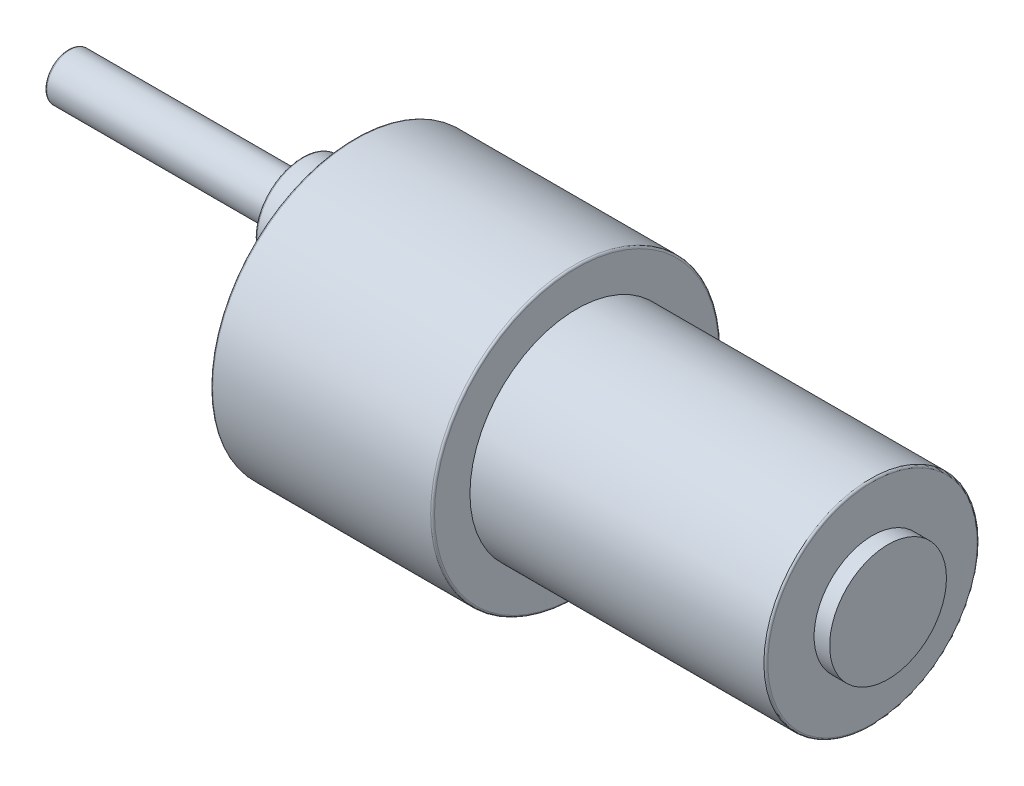
ISO-10303-21;
HEADER;
FILE_DESCRIPTION(('STEP AP214'),'2;1');
FILE_NAME('part.step','',(''),(''),'','','');
FILE_SCHEMA(('AUTOMOTIVE_DESIGN { 1 0 10303 214 1 1 1 1 }'));
ENDSEC;
DATA;
#1=APPLICATION_CONTEXT('core data for automotive mechanical design processes');
#2=APPLICATION_PROTOCOL_DEFINITION('international standard','automotive_design',2000,#1);
#3=PRODUCT_CONTEXT('',#1,'mechanical');
#4=PRODUCT('Part','Part','',(#3));
#5=PRODUCT_RELATED_PRODUCT_CATEGORY('part','',(#4));
#6=PRODUCT_DEFINITION_FORMATION('','',#4);
#7=PRODUCT_DEFINITION_CONTEXT('part definition',#1,'design');
#8=PRODUCT_DEFINITION('design','',#6,#7);
#9=PRODUCT_DEFINITION_SHAPE('','',#8);
#10=(LENGTH_UNIT() NAMED_UNIT(*) SI_UNIT(.MILLI.,.METRE.));
#11=(NAMED_UNIT(*) PLANE_ANGLE_UNIT() SI_UNIT($,.RADIAN.));
#12=(NAMED_UNIT(*) SI_UNIT($,.STERADIAN.) SOLID_ANGLE_UNIT());
#13=UNCERTAINTY_MEASURE_WITH_UNIT(LENGTH_MEASURE(1.E-05),#10,'distance_accuracy_value','');
#14=(GEOMETRIC_REPRESENTATION_CONTEXT(3) GLOBAL_UNCERTAINTY_ASSIGNED_CONTEXT((#13)) GLOBAL_UNIT_ASSIGNED_CONTEXT((#10,
#11,#12)) REPRESENTATION_CONTEXT('',''));
#15=CARTESIAN_POINT('',(0.,0.,0.));
#16=DIRECTION('',(0.,0.,1.));
#17=DIRECTION('',(1.,0.,0.));
#18=AXIS2_PLACEMENT_3D('',#15,#16,#17);
#19=CARTESIAN_POINT('',(28.5,0.,0.));
#20=DIRECTION('',(-1.,0.,0.));
#21=DIRECTION('',(0.,0.,1.));
#22=AXIS2_PLACEMENT_3D('',#19,#20,#21);
#23=CYLINDRICAL_SURFACE('',#22,18.5);
#24=CARTESIAN_POINT('',(28.25,0.,0.));
#25=DIRECTION('',(1.,0.,0.));
#26=DIRECTION('',(0.,0.,-1.));
#27=AXIS2_PLACEMENT_3D('',#24,#25,#26);
#28=CIRCLE('',#27,18.5);
#29=CARTESIAN_POINT('',(28.25,0.,18.5));
#30=VERTEX_POINT('',#29);
#31=EDGE_CURVE('E130',#30,#30,#28,.F.);
#32=CARTESIAN_POINT('',(0.25,0.,0.));
#33=DIRECTION('',(1.,0.,0.));
#34=DIRECTION('',(0.,0.,-1.));
#35=AXIS2_PLACEMENT_3D('',#32,#33,#34);
#36=CIRCLE('',#35,18.5);
#37=CARTESIAN_POINT('',(0.25,0.,18.5));
#38=VERTEX_POINT('',#37);
#39=EDGE_CURVE('E127',#38,#38,#36,.T.);
#40=CARTESIAN_POINT('',(28.25,0.,18.5));
#41=CARTESIAN_POINT('',(27.9583333333333,0.,18.5));
#42=CARTESIAN_POINT('',(27.6666666666667,0.,18.5));
#43=CARTESIAN_POINT('',(27.0833333333333,0.,18.5));
#44=CARTESIAN_POINT('',(26.7916666666667,0.,18.5));
#45=CARTESIAN_POINT('',(26.2083333333333,0.,18.5));
#46=CARTESIAN_POINT('',(25.9166666666667,0.,18.5));
#47=CARTESIAN_POINT('',(25.3333333333333,0.,18.5));
#48=CARTESIAN_POINT('',(25.0416666666667,0.,18.5));
#49=CARTESIAN_POINT('',(24.4583333333333,0.,18.5));
#50=CARTESIAN_POINT('',(24.1666666666667,0.,18.5));
#51=CARTESIAN_POINT('',(23.5833333333333,0.,18.5));
#52=CARTESIAN_POINT('',(23.2916666666667,0.,18.5));
#53=CARTESIAN_POINT('',(22.7083333333333,0.,18.5));
#54=CARTESIAN_POINT('',(22.4166666666667,0.,18.5));
#55=CARTESIAN_POINT('',(21.8333333333333,0.,18.5));
#56=CARTESIAN_POINT('',(21.5416666666667,0.,18.5));
#57=CARTESIAN_POINT('',(20.9583333333333,0.,18.5));
#58=CARTESIAN_POINT('',(20.6666666666667,0.,18.5));
#59=CARTESIAN_POINT('',(20.0833333333333,0.,18.5));
#60=CARTESIAN_POINT('',(19.7916666666667,0.,18.5));
#61=CARTESIAN_POINT('',(19.2083333333333,0.,18.5));
#62=CARTESIAN_POINT('',(18.9166666666667,0.,18.5));
#63=CARTESIAN_POINT('',(18.3333333333333,0.,18.5));
#64=CARTESIAN_POINT('',(18.0416666666667,0.,18.5));
#65=CARTESIAN_POINT('',(17.4583333333333,0.,18.5));
#66=CARTESIAN_POINT('',(17.1666666666667,0.,18.5));
#67=CARTESIAN_POINT('',(16.5833333333333,0.,18.5));
#68=CARTESIAN_POINT('',(16.2916666666667,0.,18.5));
#69=CARTESIAN_POINT('',(15.7083333333333,0.,18.5));
#70=CARTESIAN_POINT('',(15.4166666666667,0.,18.5));
#71=CARTESIAN_POINT('',(14.8333333333333,0.,18.5));
#72=CARTESIAN_POINT('',(14.5416666666667,0.,18.5));
#73=CARTESIAN_POINT('',(13.9583333333333,0.,18.5));
#74=CARTESIAN_POINT('',(13.6666666666667,0.,18.5));
#75=CARTESIAN_POINT('',(13.0833333333333,0.,18.5));
#76=CARTESIAN_POINT('',(12.7916666666667,0.,18.5));
#77=CARTESIAN_POINT('',(12.2083333333333,0.,18.5));
#78=CARTESIAN_POINT('',(11.9166666666667,0.,18.5));
#79=CARTESIAN_POINT('',(11.3333333333333,0.,18.5));
#80=CARTESIAN_POINT('',(11.0416666666667,0.,18.5));
#81=CARTESIAN_POINT('',(10.4583333333333,0.,18.5));
#82=CARTESIAN_POINT('',(10.1666666666667,0.,18.5));
#83=CARTESIAN_POINT('',(9.58333333333333,0.,18.5));
#84=CARTESIAN_POINT('',(9.29166666666667,0.,18.5));
#85=CARTESIAN_POINT('',(8.70833333333333,0.,18.5));
#86=CARTESIAN_POINT('',(8.41666666666667,0.,18.5));
#87=CARTESIAN_POINT('',(7.83333333333333,0.,18.5));
#88=CARTESIAN_POINT('',(7.54166666666667,0.,18.5));
#89=CARTESIAN_POINT('',(6.95833333333333,0.,18.5));
#90=CARTESIAN_POINT('',(6.66666666666667,0.,18.5));
#91=CARTESIAN_POINT('',(6.08333333333333,0.,18.5));
#92=CARTESIAN_POINT('',(5.79166666666666,0.,18.5));
#93=CARTESIAN_POINT('',(5.20833333333333,0.,18.5));
#94=CARTESIAN_POINT('',(4.91666666666666,0.,18.5));
#95=CARTESIAN_POINT('',(4.33333333333333,0.,18.5));
#96=CARTESIAN_POINT('',(4.04166666666666,0.,18.5));
#97=CARTESIAN_POINT('',(3.45833333333333,0.,18.5));
#98=CARTESIAN_POINT('',(3.16666666666666,0.,18.5));
#99=CARTESIAN_POINT('',(2.58333333333333,0.,18.5));
#100=CARTESIAN_POINT('',(2.29166666666667,0.,18.5));
#101=CARTESIAN_POINT('',(1.70833333333333,0.,18.5));
#102=CARTESIAN_POINT('',(1.41666666666667,0.,18.5));
#103=CARTESIAN_POINT('',(0.833333333333334,0.,18.5));
#104=CARTESIAN_POINT('',(0.541666666666667,0.,18.5));
#105=CARTESIAN_POINT('',(0.25,0.,18.5));
#106=B_SPLINE_CURVE_WITH_KNOTS('',3,(#40,#41,#42,#43,#44,#45,#46,#47,#48,#49,#50,#51,#52,#53,
#54,#55,#56,#57,#58,#59,#60,#61,#62,#63,#64,#65,#66,#67,#68,#69,#70,#71,#72,#73,#74,#75,#76,#77,
#78,#79,#80,#81,#82,#83,#84,#85,#86,#87,#88,#89,#90,#91,#92,#93,#94,#95,#96,#97,#98,#99,#100,
#101,#102,#103,#104,#105),.UNSPECIFIED.,.F.,.F.,(4,2,2,2,2,2,2,2,2,2,2,2,2,2,2,2,2,2,2,2,2,2,2,
2,2,2,2,2,2,2,2,2,4),(0.,0.875000000000001,1.75,2.625,3.5,4.375,5.25,6.125,7.,7.875,8.75,9.625,
10.5,11.375,12.25,13.125,14.,14.875,15.75,16.625,17.5,18.375,19.25,20.125,21.,21.875,22.75,
23.625,24.5,25.375,26.25,27.125,28.),.UNSPECIFIED.);
#107=EDGE_CURVE('BSEAM37',#30,#38,#106,.T.);
#108=ORIENTED_EDGE('',*,*,#31,.T.);
#109=ORIENTED_EDGE('',*,*,#39,.T.);
#110=ORIENTED_EDGE('',*,*,#107,.T.);
#111=ORIENTED_EDGE('',*,*,#107,.F.);
#112=EDGE_LOOP('',(#108,#110,#109,#111));
#113=FACE_BOUND('',#112,.T.);
#114=ADVANCED_FACE('F37',(#113),#23,.T.);
#115=CARTESIAN_POINT('',(28.5,0.,0.));
#116=DIRECTION('',(1.,0.,0.));
#117=DIRECTION('',(0.,0.,-1.));
#118=AXIS2_PLACEMENT_3D('',#115,#116,#117);
#119=PLANE('',#118);
#120=CARTESIAN_POINT('',(28.5,0.,0.));
#121=DIRECTION('',(1.,0.,0.));
#122=DIRECTION('',(0.,0.,-1.));
#123=AXIS2_PLACEMENT_3D('',#120,#121,#122);
#124=CIRCLE('',#123,18.25);
#125=CARTESIAN_POINT('',(28.5,0.,-18.25));
#126=VERTEX_POINT('',#125);
#127=EDGE_CURVE('E124',#126,#126,#124,.T.);
#128=ORIENTED_EDGE('',*,*,#127,.T.);
#129=EDGE_LOOP('',(#128));
#130=FACE_BOUND('',#129,.T.);
#131=CARTESIAN_POINT('',(28.5,0.,0.));
#132=DIRECTION('',(1.,0.,0.));
#133=DIRECTION('',(0.,0.,-1.));
#134=AXIS2_PLACEMENT_3D('',#131,#132,#133);
#135=CIRCLE('',#134,13.7);
#136=CARTESIAN_POINT('',(28.5,0.,-13.7));
#137=VERTEX_POINT('',#136);
#138=EDGE_CURVE('E113',#137,#137,#135,.T.);
#139=ORIENTED_EDGE('',*,*,#138,.F.);
#140=EDGE_LOOP('',(#139));
#141=FACE_BOUND('',#140,.T.);
#142=ADVANCED_FACE('F173',(#130,#141),#119,.T.);
#143=CARTESIAN_POINT('',(0.,0.,0.));
#144=DIRECTION('',(1.,0.,0.));
#145=DIRECTION('',(0.,0.,-1.));
#146=AXIS2_PLACEMENT_3D('',#143,#144,#145);
#147=PLANE('',#146);
#148=CARTESIAN_POINT('',(0.,0.,0.));
#149=DIRECTION('',(1.,0.,0.));
#150=DIRECTION('',(0.,0.,-1.));
#151=AXIS2_PLACEMENT_3D('',#148,#149,#150);
#152=CIRCLE('',#151,18.25);
#153=CARTESIAN_POINT('',(0.,0.,-18.25));
#154=VERTEX_POINT('',#153);
#155=EDGE_CURVE('E136',#154,#154,#152,.F.);
#156=ORIENTED_EDGE('',*,*,#155,.T.);
#157=EDGE_LOOP('',(#156));
#158=FACE_BOUND('',#157,.T.);
#159=CARTESIAN_POINT('',(0.,7.,0.));
#160=DIRECTION('',(1.,0.,0.));
#161=DIRECTION('',(0.,0.,-1.));
#162=AXIS2_PLACEMENT_3D('',#159,#160,#161);
#163=CIRCLE('',#162,6.25);
#164=CARTESIAN_POINT('',(0.,7.,-6.25));
#165=VERTEX_POINT('',#164);
#166=EDGE_CURVE('E133',#165,#165,#163,.T.);
#167=ORIENTED_EDGE('',*,*,#166,.T.);
#168=EDGE_LOOP('',(#167));
#169=FACE_BOUND('',#168,.T.);
#170=CARTESIAN_POINT('',(0.,15.75,0.));
#171=DIRECTION('',(-1.,0.,0.));
#172=DIRECTION('',(0.,0.,1.));
#173=AXIS2_PLACEMENT_3D('',#170,#171,#172);
#174=CIRCLE('',#173,1.25);
#175=CARTESIAN_POINT('',(0.,15.75,1.25));
#176=VERTEX_POINT('',#175);
#177=EDGE_CURVE('E75',#176,#176,#174,.T.);
#178=ORIENTED_EDGE('',*,*,#177,.F.);
#179=EDGE_LOOP('',(#178));
#180=FACE_BOUND('',#179,.T.);
#181=CARTESIAN_POINT('',(0.,7.87499999999997,13.6399001096049));
#182=DIRECTION('',(-1.,0.,0.));
#183=DIRECTION('',(0.,0.,1.));
#184=AXIS2_PLACEMENT_3D('',#181,#182,#183);
#185=CIRCLE('',#184,1.25);
#186=CARTESIAN_POINT('',(0.,7.87499999999997,14.8899001096049));
#187=VERTEX_POINT('',#186);
#188=EDGE_CURVE('E74',#187,#187,#185,.T.);
#189=ORIENTED_EDGE('',*,*,#188,.F.);
#190=EDGE_LOOP('',(#189));
#191=FACE_BOUND('',#190,.T.);
#192=CARTESIAN_POINT('',(0.,-7.87500000000006,13.6399001096049));
#193=DIRECTION('',(-1.,0.,0.));
#194=DIRECTION('',(0.,0.,1.));
#195=AXIS2_PLACEMENT_3D('',#192,#193,#194);
#196=CIRCLE('',#195,1.25);
#197=CARTESIAN_POINT('',(0.,-7.87500000000006,14.8899001096049));
#198=VERTEX_POINT('',#197);
#199=EDGE_CURVE('E85',#198,#198,#196,.T.);
#200=ORIENTED_EDGE('',*,*,#199,.F.);
#201=EDGE_LOOP('',(#200));
#202=FACE_BOUND('',#201,.T.);
#203=CARTESIAN_POINT('',(0.,-15.75,-1.09981662173559E-13));
#204=DIRECTION('',(-1.,0.,0.));
#205=DIRECTION('',(0.,0.,1.));
#206=AXIS2_PLACEMENT_3D('',#203,#204,#205);
#207=CIRCLE('',#206,1.25);
#208=CARTESIAN_POINT('',(0.,-15.75,1.24999999999989));
#209=VERTEX_POINT('',#208);
#210=EDGE_CURVE('E91',#209,#209,#207,.T.);
#211=ORIENTED_EDGE('',*,*,#210,.F.);
#212=EDGE_LOOP('',(#211));
#213=FACE_BOUND('',#212,.T.);
#214=CARTESIAN_POINT('',(0.,-7.87499999999987,-13.639900109605));
#215=DIRECTION('',(-1.,0.,0.));
#216=DIRECTION('',(0.,0.,1.));
#217=AXIS2_PLACEMENT_3D('',#214,#215,#216);
#218=CIRCLE('',#217,1.25);
#219=CARTESIAN_POINT('',(0.,-7.87499999999987,-12.389900109605));
#220=VERTEX_POINT('',#219);
#221=EDGE_CURVE('E97',#220,#220,#218,.T.);
#222=ORIENTED_EDGE('',*,*,#221,.F.);
#223=EDGE_LOOP('',(#222));
#224=FACE_BOUND('',#223,.T.);
#225=CARTESIAN_POINT('',(0.,7.87500000000016,-13.6399001096048));
#226=DIRECTION('',(-1.,0.,0.));
#227=DIRECTION('',(0.,0.,1.));
#228=AXIS2_PLACEMENT_3D('',#225,#226,#227);
#229=CIRCLE('',#228,1.25);
#230=CARTESIAN_POINT('',(0.,7.87500000000016,-12.3899001096048));
#231=VERTEX_POINT('',#230);
#232=EDGE_CURVE('E103',#231,#231,#229,.T.);
#233=ORIENTED_EDGE('',*,*,#232,.F.);
#234=EDGE_LOOP('',(#233));
#235=FACE_BOUND('',#234,.T.);
#236=ADVANCED_FACE('F179',(#158,#169,#180,#191,#202,#213,#224,#235),#147,.F.);
#237=CARTESIAN_POINT('',(66.5,0.,0.));
#238=DIRECTION('',(-1.,0.,0.));
#239=DIRECTION('',(0.,0.,1.));
#240=AXIS2_PLACEMENT_3D('',#237,#238,#239);
#241=CYLINDRICAL_SURFACE('',#240,13.7);
#242=CARTESIAN_POINT('',(66.25,0.,0.));
#243=DIRECTION('',(1.,0.,0.));
#244=DIRECTION('',(0.,0.,-1.));
#245=AXIS2_PLACEMENT_3D('',#242,#243,#244);
#246=CIRCLE('',#245,13.7);
#247=CARTESIAN_POINT('',(66.25,0.,-13.7));
#248=VERTEX_POINT('',#247);
#249=EDGE_CURVE('E121',#248,#248,#246,.F.);
#250=ORIENTED_EDGE('',*,*,#249,.T.);
#251=EDGE_LOOP('',(#250));
#252=FACE_BOUND('',#251,.T.);
#253=ORIENTED_EDGE('',*,*,#138,.T.);
#254=EDGE_LOOP('',(#253));
#255=FACE_BOUND('',#254,.T.);
#256=ADVANCED_FACE('F274',(#252,#255),#241,.T.);
#257=CARTESIAN_POINT('',(66.5,0.,0.));
#258=DIRECTION('',(1.,0.,0.));
#259=DIRECTION('',(0.,0.,-1.));
#260=AXIS2_PLACEMENT_3D('',#257,#258,#259);
#261=PLANE('',#260);
#262=CARTESIAN_POINT('',(66.5,0.,0.));
#263=DIRECTION('',(1.,0.,0.));
#264=DIRECTION('',(0.,0.,-1.));
#265=AXIS2_PLACEMENT_3D('',#262,#263,#264);
#266=CIRCLE('',#265,13.45);
#267=CARTESIAN_POINT('',(66.5,0.,-13.45));
#268=VERTEX_POINT('',#267);
#269=EDGE_CURVE('E118',#268,#268,#266,.T.);
#270=ORIENTED_EDGE('',*,*,#269,.T.);
#271=EDGE_LOOP('',(#270));
#272=FACE_BOUND('',#271,.T.);
#273=CARTESIAN_POINT('',(66.5,0.,0.));
#274=DIRECTION('',(1.,0.,0.));
#275=DIRECTION('',(0.,0.,-1.));
#276=AXIS2_PLACEMENT_3D('',#273,#274,#275);
#277=CIRCLE('',#276,7.5);
#278=CARTESIAN_POINT('',(66.5,0.,-7.5));
#279=VERTEX_POINT('',#278);
#280=EDGE_CURVE('E109',#279,#279,#277,.T.);
#281=ORIENTED_EDGE('',*,*,#280,.F.);
#282=EDGE_LOOP('',(#281));
#283=FACE_BOUND('',#282,.T.);
#284=ADVANCED_FACE('F270',(#272,#283),#261,.T.);
#285=CARTESIAN_POINT('',(68.5,0.,0.));
#286=DIRECTION('',(-1.,0.,0.));
#287=DIRECTION('',(0.,0.,1.));
#288=AXIS2_PLACEMENT_3D('',#285,#286,#287);
#289=CYLINDRICAL_SURFACE('',#288,7.5);
#290=CARTESIAN_POINT('',(68.5,0.,0.));
#291=DIRECTION('',(1.,0.,0.));
#292=DIRECTION('',(0.,0.,-1.));
#293=AXIS2_PLACEMENT_3D('',#290,#291,#292);
#294=CIRCLE('',#293,7.5);
#295=CARTESIAN_POINT('',(68.5,0.,-7.5));
#296=VERTEX_POINT('',#295);
#297=EDGE_CURVE('E110',#296,#296,#294,.T.);
#298=ORIENTED_EDGE('',*,*,#297,.F.);
#299=EDGE_LOOP('',(#298));
#300=FACE_BOUND('',#299,.T.);
#301=ORIENTED_EDGE('',*,*,#280,.T.);
#302=EDGE_LOOP('',(#301));
#303=FACE_BOUND('',#302,.T.);
#304=ADVANCED_FACE('F266',(#300,#303),#289,.T.);
#305=CARTESIAN_POINT('',(68.5,0.,0.));
#306=DIRECTION('',(1.,0.,0.));
#307=DIRECTION('',(0.,0.,-1.));
#308=AXIS2_PLACEMENT_3D('',#305,#306,#307);
#309=PLANE('',#308);
#310=ORIENTED_EDGE('',*,*,#297,.T.);
#311=EDGE_LOOP('',(#310));
#312=FACE_BOUND('',#311,.T.);
#313=ADVANCED_FACE('F263',(#312),#309,.T.);
#314=CARTESIAN_POINT('',(5.,7.87500000000016,-13.6399001096048));
#315=DIRECTION('',(-1.,0.,0.));
#316=DIRECTION('',(0.,0.,1.));
#317=AXIS2_PLACEMENT_3D('',#314,#315,#316);
#318=CONICAL_SURFACE('',#317,1.25,1.02974425867665);
#319=CARTESIAN_POINT('',(5.75107577378445,7.87500000000016,-13.6399001096048));
#320=VERTEX_POINT('',#319);
#321=VERTEX_LOOP('',#320);
#322=FACE_BOUND('',#321,.T.);
#323=CARTESIAN_POINT('',(5.,7.87500000000016,-13.6399001096048));
#324=DIRECTION('',(-1.,0.,0.));
#325=DIRECTION('',(0.,0.,1.));
#326=AXIS2_PLACEMENT_3D('',#323,#324,#325);
#327=CIRCLE('',#326,1.25);
#328=CARTESIAN_POINT('',(5.,7.87500000000016,-12.3899001096048));
#329=VERTEX_POINT('',#328);
#330=EDGE_CURVE('E106',#329,#329,#327,.T.);
#331=ORIENTED_EDGE('',*,*,#330,.T.);
#332=EDGE_LOOP('',(#331));
#333=FACE_BOUND('',#332,.T.);
#334=ADVANCED_FACE('F259',(#322,#333),#318,.F.);
#335=CARTESIAN_POINT('',(0.,7.87500000000016,-13.6399001096048));
#336=DIRECTION('',(-1.,0.,0.));
#337=DIRECTION('',(0.,0.,1.));
#338=AXIS2_PLACEMENT_3D('',#335,#336,#337);
#339=CYLINDRICAL_SURFACE('',#338,1.25);
#340=ORIENTED_EDGE('',*,*,#330,.F.);
#341=EDGE_LOOP('',(#340));
#342=FACE_BOUND('',#341,.T.);
#343=ORIENTED_EDGE('',*,*,#232,.T.);
#344=EDGE_LOOP('',(#343));
#345=FACE_BOUND('',#344,.T.);
#346=ADVANCED_FACE('F256',(#342,#345),#339,.F.);
#347=CARTESIAN_POINT('',(5.,-7.87499999999987,-13.639900109605));
#348=DIRECTION('',(-1.,0.,0.));
#349=DIRECTION('',(0.,0.,1.));
#350=AXIS2_PLACEMENT_3D('',#347,#348,#349);
#351=CONICAL_SURFACE('',#350,1.25,1.02974425867665);
#352=CARTESIAN_POINT('',(5.75107577378445,-7.87499999999987,-13.639900109605));
#353=VERTEX_POINT('',#352);
#354=VERTEX_LOOP('',#353);
#355=FACE_BOUND('',#354,.T.);
#356=CARTESIAN_POINT('',(5.,-7.87499999999987,-13.639900109605));
#357=DIRECTION('',(-1.,0.,0.));
#358=DIRECTION('',(0.,0.,1.));
#359=AXIS2_PLACEMENT_3D('',#356,#357,#358);
#360=CIRCLE('',#359,1.25);
#361=CARTESIAN_POINT('',(5.,-7.87499999999987,-12.389900109605));
#362=VERTEX_POINT('',#361);
#363=EDGE_CURVE('E100',#362,#362,#360,.T.);
#364=ORIENTED_EDGE('',*,*,#363,.T.);
#365=EDGE_LOOP('',(#364));
#366=FACE_BOUND('',#365,.T.);
#367=ADVANCED_FACE('F252',(#355,#366),#351,.F.);
#368=CARTESIAN_POINT('',(0.,-7.87499999999987,-13.639900109605));
#369=DIRECTION('',(-1.,0.,0.));
#370=DIRECTION('',(0.,0.,1.));
#371=AXIS2_PLACEMENT_3D('',#368,#369,#370);
#372=CYLINDRICAL_SURFACE('',#371,1.25);
#373=ORIENTED_EDGE('',*,*,#363,.F.);
#374=EDGE_LOOP('',(#373));
#375=FACE_BOUND('',#374,.T.);
#376=ORIENTED_EDGE('',*,*,#221,.T.);
#377=EDGE_LOOP('',(#376));
#378=FACE_BOUND('',#377,.T.);
#379=ADVANCED_FACE('F248',(#375,#378),#372,.F.);
#380=CARTESIAN_POINT('',(5.,-15.75,-1.09981662173559E-13));
#381=DIRECTION('',(-1.,0.,0.));
#382=DIRECTION('',(0.,0.,1.));
#383=AXIS2_PLACEMENT_3D('',#380,#381,#382);
#384=CONICAL_SURFACE('',#383,1.25,1.02974425867665);
#385=CARTESIAN_POINT('',(5.75107577378445,-15.75,-1.09981662173559E-13));
#386=VERTEX_POINT('',#385);
#387=VERTEX_LOOP('',#386);
#388=FACE_BOUND('',#387,.T.);
#389=CARTESIAN_POINT('',(5.,-15.75,-1.09981662173559E-13));
#390=DIRECTION('',(-1.,0.,0.));
#391=DIRECTION('',(0.,0.,1.));
#392=AXIS2_PLACEMENT_3D('',#389,#390,#391);
#393=CIRCLE('',#392,1.25);
#394=CARTESIAN_POINT('',(5.,-15.75,1.24999999999989));
#395=VERTEX_POINT('',#394);
#396=EDGE_CURVE('E94',#395,#395,#393,.T.);
#397=ORIENTED_EDGE('',*,*,#396,.T.);
#398=EDGE_LOOP('',(#397));
#399=FACE_BOUND('',#398,.T.);
#400=ADVANCED_FACE('F244',(#388,#399),#384,.F.);
#401=CARTESIAN_POINT('',(0.,-15.75,-1.09981662173559E-13));
#402=DIRECTION('',(-1.,0.,0.));
#403=DIRECTION('',(0.,0.,1.));
#404=AXIS2_PLACEMENT_3D('',#401,#402,#403);
#405=CYLINDRICAL_SURFACE('',#404,1.25);
#406=ORIENTED_EDGE('',*,*,#396,.F.);
#407=EDGE_LOOP('',(#406));
#408=FACE_BOUND('',#407,.T.);
#409=ORIENTED_EDGE('',*,*,#210,.T.);
#410=EDGE_LOOP('',(#409));
#411=FACE_BOUND('',#410,.T.);
#412=ADVANCED_FACE('F240',(#408,#411),#405,.F.);
#413=CARTESIAN_POINT('',(5.,-7.87500000000006,13.6399001096049));
#414=DIRECTION('',(-1.,0.,0.));
#415=DIRECTION('',(0.,0.,1.));
#416=AXIS2_PLACEMENT_3D('',#413,#414,#415);
#417=CONICAL_SURFACE('',#416,1.25,1.02974425867665);
#418=CARTESIAN_POINT('',(5.75107577378445,-7.87500000000007,13.6399001096049));
#419=VERTEX_POINT('',#418);
#420=VERTEX_LOOP('',#419);
#421=FACE_BOUND('',#420,.T.);
#422=CARTESIAN_POINT('',(5.,-7.87500000000006,13.6399001096049));
#423=DIRECTION('',(-1.,0.,0.));
#424=DIRECTION('',(0.,0.,1.));
#425=AXIS2_PLACEMENT_3D('',#422,#423,#424);
#426=CIRCLE('',#425,1.25);
#427=CARTESIAN_POINT('',(5.,-7.87500000000006,14.8899001096049));
#428=VERTEX_POINT('',#427);
#429=EDGE_CURVE('E88',#428,#428,#426,.T.);
#430=ORIENTED_EDGE('',*,*,#429,.T.);
#431=EDGE_LOOP('',(#430));
#432=FACE_BOUND('',#431,.T.);
#433=ADVANCED_FACE('F236',(#421,#432),#417,.F.);
#434=CARTESIAN_POINT('',(0.,-7.87500000000006,13.6399001096049));
#435=DIRECTION('',(-1.,0.,0.));
#436=DIRECTION('',(0.,0.,1.));
#437=AXIS2_PLACEMENT_3D('',#434,#435,#436);
#438=CYLINDRICAL_SURFACE('',#437,1.25);
#439=ORIENTED_EDGE('',*,*,#429,.F.);
#440=EDGE_LOOP('',(#439));
#441=FACE_BOUND('',#440,.T.);
#442=ORIENTED_EDGE('',*,*,#199,.T.);
#443=EDGE_LOOP('',(#442));
#444=FACE_BOUND('',#443,.T.);
#445=ADVANCED_FACE('F232',(#441,#444),#438,.F.);
#446=CARTESIAN_POINT('',(5.,7.87499999999997,13.6399001096049));
#447=DIRECTION('',(-1.,0.,0.));
#448=DIRECTION('',(0.,0.,1.));
#449=AXIS2_PLACEMENT_3D('',#446,#447,#448);
#450=CONICAL_SURFACE('',#449,1.25,1.02974425867665);
#451=CARTESIAN_POINT('',(5.75107577378445,7.87499999999997,13.6399001096049));
#452=VERTEX_POINT('',#451);
#453=VERTEX_LOOP('',#452);
#454=FACE_BOUND('',#453,.T.);
#455=CARTESIAN_POINT('',(5.,7.87499999999997,13.6399001096049));
#456=DIRECTION('',(-1.,0.,0.));
#457=DIRECTION('',(0.,0.,1.));
#458=AXIS2_PLACEMENT_3D('',#455,#456,#457);
#459=CIRCLE('',#458,1.25);
#460=CARTESIAN_POINT('',(5.,7.87499999999997,14.8899001096049));
#461=VERTEX_POINT('',#460);
#462=EDGE_CURVE('E78',#461,#461,#459,.T.);
#463=ORIENTED_EDGE('',*,*,#462,.T.);
#464=EDGE_LOOP('',(#463));
#465=FACE_BOUND('',#464,.T.);
#466=ADVANCED_FACE('F228',(#454,#465),#450,.F.);
#467=CARTESIAN_POINT('',(0.,7.87499999999997,13.6399001096049));
#468=DIRECTION('',(-1.,0.,0.));
#469=DIRECTION('',(0.,0.,1.));
#470=AXIS2_PLACEMENT_3D('',#467,#468,#469);
#471=CYLINDRICAL_SURFACE('',#470,1.25);
#472=ORIENTED_EDGE('',*,*,#462,.F.);
#473=EDGE_LOOP('',(#472));
#474=FACE_BOUND('',#473,.T.);
#475=ORIENTED_EDGE('',*,*,#188,.T.);
#476=EDGE_LOOP('',(#475));
#477=FACE_BOUND('',#476,.T.);
#478=ADVANCED_FACE('F68',(#474,#477),#471,.F.);
#479=CARTESIAN_POINT('',(5.,15.75,0.));
#480=DIRECTION('',(-1.,0.,0.));
#481=DIRECTION('',(0.,0.,1.));
#482=AXIS2_PLACEMENT_3D('',#479,#480,#481);
#483=CONICAL_SURFACE('',#482,1.25,1.02974425867665);
#484=CARTESIAN_POINT('',(5.75107577378445,15.75,0.));
#485=VERTEX_POINT('',#484);
#486=VERTEX_LOOP('',#485);
#487=FACE_BOUND('',#486,.T.);
#488=CARTESIAN_POINT('',(5.,15.75,0.));
#489=DIRECTION('',(-1.,0.,0.));
#490=DIRECTION('',(0.,0.,1.));
#491=AXIS2_PLACEMENT_3D('',#488,#489,#490);
#492=CIRCLE('',#491,1.25);
#493=CARTESIAN_POINT('',(5.,15.75,1.25));
#494=VERTEX_POINT('',#493);
#495=EDGE_CURVE('E72',#494,#494,#492,.T.);
#496=ORIENTED_EDGE('',*,*,#495,.T.);
#497=EDGE_LOOP('',(#496));
#498=FACE_BOUND('',#497,.T.);
#499=ADVANCED_FACE('F64',(#487,#498),#483,.F.);
#500=CARTESIAN_POINT('',(0.,15.75,0.));
#501=DIRECTION('',(-1.,0.,0.));
#502=DIRECTION('',(0.,0.,1.));
#503=AXIS2_PLACEMENT_3D('',#500,#501,#502);
#504=CYLINDRICAL_SURFACE('',#503,1.25);
#505=ORIENTED_EDGE('',*,*,#495,.F.);
#506=EDGE_LOOP('',(#505));
#507=FACE_BOUND('',#506,.T.);
#508=ORIENTED_EDGE('',*,*,#177,.T.);
#509=EDGE_LOOP('',(#508));
#510=FACE_BOUND('',#509,.T.);
#511=ADVANCED_FACE('F67',(#507,#510),#504,.F.);
#512=CARTESIAN_POINT('',(-6.8,7.,0.));
#513=DIRECTION('',(1.,0.,0.));
#514=DIRECTION('',(0.,0.,-1.));
#515=AXIS2_PLACEMENT_3D('',#512,#513,#514);
#516=CYLINDRICAL_SURFACE('',#515,6.);
#517=CARTESIAN_POINT('',(-0.25,7.,0.));
#518=DIRECTION('',(1.,0.,0.));
#519=DIRECTION('',(0.,0.,-1.));
#520=AXIS2_PLACEMENT_3D('',#517,#518,#519);
#521=CIRCLE('',#520,6.);
#522=CARTESIAN_POINT('',(-0.25,7.,-6.));
#523=VERTEX_POINT('',#522);
#524=EDGE_CURVE('E142',#523,#523,#521,.F.);
#525=ORIENTED_EDGE('',*,*,#524,.T.);
#526=EDGE_LOOP('',(#525));
#527=FACE_BOUND('',#526,.T.);
#528=CARTESIAN_POINT('',(-6.55,7.,0.));
#529=DIRECTION('',(-1.,0.,0.));
#530=DIRECTION('',(0.,0.,1.));
#531=AXIS2_PLACEMENT_3D('',#528,#529,#530);
#532=CIRCLE('',#531,6.);
#533=CARTESIAN_POINT('',(-6.55,7.,6.));
#534=VERTEX_POINT('',#533);
#535=EDGE_CURVE('E139',#534,#534,#532,.F.);
#536=ORIENTED_EDGE('',*,*,#535,.T.);
#537=EDGE_LOOP('',(#536));
#538=FACE_BOUND('',#537,.T.);
#539=ADVANCED_FACE('F206',(#527,#538),#516,.T.);
#540=CARTESIAN_POINT('',(-6.8,7.,0.));
#541=DIRECTION('',(-1.,0.,0.));
#542=DIRECTION('',(0.,0.,1.));
#543=AXIS2_PLACEMENT_3D('',#540,#541,#542);
#544=PLANE('',#543);
#545=CARTESIAN_POINT('',(-6.8,7.,0.));
#546=DIRECTION('',(-1.,0.,0.));
#547=DIRECTION('',(0.,0.,1.));
#548=AXIS2_PLACEMENT_3D('',#545,#546,#547);
#549=CIRCLE('',#548,5.75);
#550=CARTESIAN_POINT('',(-6.8,7.,5.75));
#551=VERTEX_POINT('',#550);
#552=EDGE_CURVE('E148',#551,#551,#549,.T.);
#553=ORIENTED_EDGE('',*,*,#552,.T.);
#554=EDGE_LOOP('',(#553));
#555=FACE_BOUND('',#554,.T.);
#556=CARTESIAN_POINT('',(-6.8,7.,0.));
#557=DIRECTION('',(-1.,0.,0.));
#558=DIRECTION('',(0.,0.,1.));
#559=AXIS2_PLACEMENT_3D('',#556,#557,#558);
#560=CIRCLE('',#559,3.25);
#561=CARTESIAN_POINT('',(-6.8,7.,3.25));
#562=VERTEX_POINT('',#561);
#563=EDGE_CURVE('E145',#562,#562,#560,.F.);
#564=ORIENTED_EDGE('',*,*,#563,.T.);
#565=EDGE_LOOP('',(#564));
#566=FACE_BOUND('',#565,.T.);
#567=ADVANCED_FACE('F209',(#555,#566),#544,.T.);
#568=CARTESIAN_POINT('',(-36.8,7.,0.));
#569=DIRECTION('',(1.,0.,0.));
#570=DIRECTION('',(0.,0.,-1.));
#571=AXIS2_PLACEMENT_3D('',#568,#569,#570);
#572=CYLINDRICAL_SURFACE('',#571,3.);
#573=CARTESIAN_POINT('',(-7.05,7.,0.));
#574=DIRECTION('',(-1.,0.,0.));
#575=DIRECTION('',(0.,0.,1.));
#576=AXIS2_PLACEMENT_3D('',#573,#574,#575);
#577=CIRCLE('',#576,3.);
#578=CARTESIAN_POINT('',(-7.05,7.,3.));
#579=VERTEX_POINT('',#578);
#580=EDGE_CURVE('E45',#579,#579,#577,.T.);
#581=ORIENTED_EDGE('',*,*,#580,.T.);
#582=EDGE_LOOP('',(#581));
#583=FACE_BOUND('',#582,.T.);
#584=CARTESIAN_POINT('',(-36.55,7.,0.));
#585=DIRECTION('',(-1.,0.,0.));
#586=DIRECTION('',(0.,0.,1.));
#587=AXIS2_PLACEMENT_3D('',#584,#585,#586);
#588=CIRCLE('',#587,3.);
#589=CARTESIAN_POINT('',(-36.55,7.,3.));
#590=VERTEX_POINT('',#589);
#591=EDGE_CURVE('E151',#590,#590,#588,.F.);
#592=ORIENTED_EDGE('',*,*,#591,.T.);
#593=EDGE_LOOP('',(#592));
#594=FACE_BOUND('',#593,.T.);
#595=ADVANCED_FACE('F156',(#583,#594),#572,.T.);
#596=CARTESIAN_POINT('',(-36.8,7.,0.));
#597=DIRECTION('',(-1.,0.,0.));
#598=DIRECTION('',(0.,0.,1.));
#599=AXIS2_PLACEMENT_3D('',#596,#597,#598);
#600=PLANE('',#599);
#601=CARTESIAN_POINT('',(-36.8,7.,0.));
#602=DIRECTION('',(-1.,0.,0.));
#603=DIRECTION('',(0.,0.,1.));
#604=AXIS2_PLACEMENT_3D('',#601,#602,#603);
#605=CIRCLE('',#604,2.75);
#606=CARTESIAN_POINT('',(-36.8,7.,2.75));
#607=VERTEX_POINT('',#606);
#608=EDGE_CURVE('E11',#607,#607,#605,.T.);
#609=ORIENTED_EDGE('',*,*,#608,.T.);
#610=EDGE_LOOP('',(#609));
#611=FACE_BOUND('',#610,.T.);
#612=ADVANCED_FACE('F189',(#611),#600,.T.);
#613=CARTESIAN_POINT('',(66.25,0.,0.));
#614=DIRECTION('',(1.,0.,0.));
#615=DIRECTION('',(0.,0.,-1.));
#616=AXIS2_PLACEMENT_3D('',#613,#614,#615);
#617=TOROIDAL_SURFACE('',#616,13.45,0.25);
#618=ORIENTED_EDGE('',*,*,#249,.F.);
#619=EDGE_LOOP('',(#618));
#620=FACE_BOUND('',#619,.T.);
#621=ORIENTED_EDGE('',*,*,#269,.F.);
#622=EDGE_LOOP('',(#621));
#623=FACE_BOUND('',#622,.T.);
#624=ADVANCED_FACE('F185',(#620,#623),#617,.T.);
#625=CARTESIAN_POINT('',(28.25,0.,0.));
#626=DIRECTION('',(1.,0.,0.));
#627=DIRECTION('',(0.,0.,-1.));
#628=AXIS2_PLACEMENT_3D('',#625,#626,#627);
#629=TOROIDAL_SURFACE('',#628,18.25,0.25);
#630=ORIENTED_EDGE('',*,*,#31,.F.);
#631=EDGE_LOOP('',(#630));
#632=FACE_BOUND('',#631,.T.);
#633=ORIENTED_EDGE('',*,*,#127,.F.);
#634=EDGE_LOOP('',(#633));
#635=FACE_BOUND('',#634,.T.);
#636=ADVANCED_FACE('F188',(#632,#635),#629,.T.);
#637=CARTESIAN_POINT('',(0.25,0.,0.));
#638=DIRECTION('',(1.,0.,0.));
#639=DIRECTION('',(0.,0.,-1.));
#640=AXIS2_PLACEMENT_3D('',#637,#638,#639);
#641=TOROIDAL_SURFACE('',#640,18.25,0.25);
#642=ORIENTED_EDGE('',*,*,#155,.F.);
#643=EDGE_LOOP('',(#642));
#644=FACE_BOUND('',#643,.T.);
#645=ORIENTED_EDGE('',*,*,#39,.F.);
#646=EDGE_LOOP('',(#645));
#647=FACE_BOUND('',#646,.T.);
#648=ADVANCED_FACE('F193',(#644,#647),#641,.T.);
#649=CARTESIAN_POINT('',(-0.25,7.,0.));
#650=DIRECTION('',(1.,0.,0.));
#651=DIRECTION('',(0.,0.,-1.));
#652=AXIS2_PLACEMENT_3D('',#649,#650,#651);
#653=TOROIDAL_SURFACE('',#652,6.25,0.25);
#654=ORIENTED_EDGE('',*,*,#166,.F.);
#655=EDGE_LOOP('',(#654));
#656=FACE_BOUND('',#655,.T.);
#657=ORIENTED_EDGE('',*,*,#524,.F.);
#658=EDGE_LOOP('',(#657));
#659=FACE_BOUND('',#658,.T.);
#660=ADVANCED_FACE('F168',(#656,#659),#653,.F.);
#661=CARTESIAN_POINT('',(-6.55,7.,0.));
#662=DIRECTION('',(-1.,0.,0.));
#663=DIRECTION('',(0.,0.,1.));
#664=AXIS2_PLACEMENT_3D('',#661,#662,#663);
#665=TOROIDAL_SURFACE('',#664,5.75,0.25);
#666=ORIENTED_EDGE('',*,*,#535,.F.);
#667=EDGE_LOOP('',(#666));
#668=FACE_BOUND('',#667,.T.);
#669=ORIENTED_EDGE('',*,*,#552,.F.);
#670=EDGE_LOOP('',(#669));
#671=FACE_BOUND('',#670,.T.);
#672=ADVANCED_FACE('F161',(#668,#671),#665,.T.);
#673=CARTESIAN_POINT('',(-7.05,7.,0.));
#674=DIRECTION('',(-1.,0.,0.));
#675=DIRECTION('',(0.,0.,1.));
#676=AXIS2_PLACEMENT_3D('',#673,#674,#675);
#677=TOROIDAL_SURFACE('',#676,3.25,0.25);
#678=ORIENTED_EDGE('',*,*,#563,.F.);
#679=EDGE_LOOP('',(#678));
#680=FACE_BOUND('',#679,.T.);
#681=ORIENTED_EDGE('',*,*,#580,.F.);
#682=EDGE_LOOP('',(#681));
#683=FACE_BOUND('',#682,.T.);
#684=ADVANCED_FACE('F159',(#680,#683),#677,.F.);
#685=CARTESIAN_POINT('',(-36.55,7.,0.));
#686=DIRECTION('',(-1.,0.,0.));
#687=DIRECTION('',(0.,0.,1.));
#688=AXIS2_PLACEMENT_3D('',#685,#686,#687);
#689=TOROIDAL_SURFACE('',#688,2.75,0.25);
#690=ORIENTED_EDGE('',*,*,#591,.F.);
#691=EDGE_LOOP('',(#690));
#692=FACE_BOUND('',#691,.T.);
#693=ORIENTED_EDGE('',*,*,#608,.F.);
#694=EDGE_LOOP('',(#693));
#695=FACE_BOUND('',#694,.T.);
#696=ADVANCED_FACE('F39',(#692,#695),#689,.T.);
#697=CLOSED_SHELL('',(#114,#142,#236,#256,#284,#304,#313,#334,#346,#367,#379,#400,#412,#433,
#445,#466,#478,#499,#511,#539,#567,#595,#612,#624,#636,#648,#660,#672,#684,#696));
#698=MANIFOLD_SOLID_BREP('B2',#697);
#699=ADVANCED_BREP_SHAPE_REPRESENTATION('',(#18,#698),#14);
#700=SHAPE_DEFINITION_REPRESENTATION(#9,#699);
ENDSEC;
END-ISO-10303-21;
